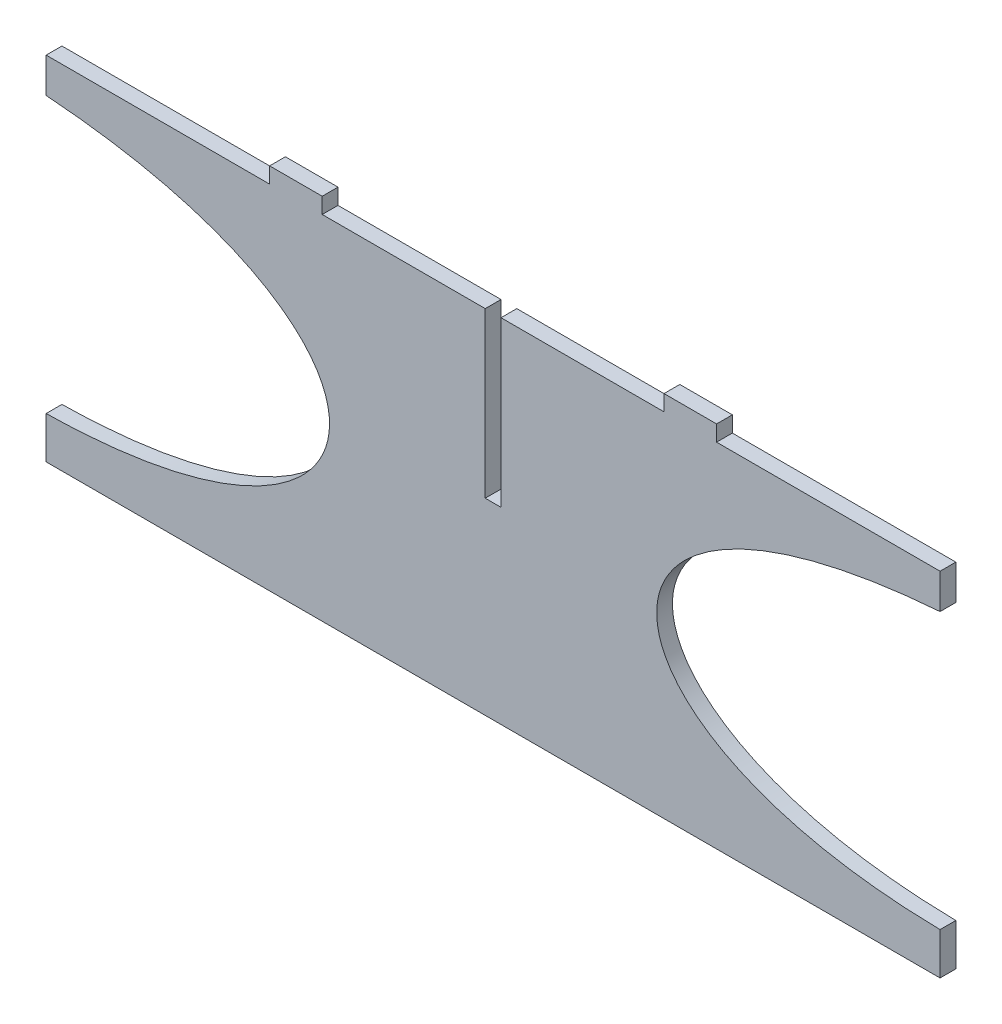
ISO-10303-21;
HEADER;
FILE_DESCRIPTION(('STEP AP214'),'2;1');
FILE_NAME('part.step','',(''),(''),'','','');
FILE_SCHEMA(('AUTOMOTIVE_DESIGN { 1 0 10303 214 1 1 1 1 }'));
ENDSEC;
DATA;
#1=APPLICATION_CONTEXT('core data for automotive mechanical design processes');
#2=APPLICATION_PROTOCOL_DEFINITION('international standard','automotive_design',2000,#1);
#3=PRODUCT_CONTEXT('',#1,'mechanical');
#4=PRODUCT('Part','Part','',(#3));
#5=PRODUCT_RELATED_PRODUCT_CATEGORY('part','',(#4));
#6=PRODUCT_DEFINITION_FORMATION('','',#4);
#7=PRODUCT_DEFINITION_CONTEXT('part definition',#1,'design');
#8=PRODUCT_DEFINITION('design','',#6,#7);
#9=PRODUCT_DEFINITION_SHAPE('','',#8);
#10=(LENGTH_UNIT() NAMED_UNIT(*) SI_UNIT(.MILLI.,.METRE.));
#11=(NAMED_UNIT(*) PLANE_ANGLE_UNIT() SI_UNIT($,.RADIAN.));
#12=(NAMED_UNIT(*) SI_UNIT($,.STERADIAN.) SOLID_ANGLE_UNIT());
#13=UNCERTAINTY_MEASURE_WITH_UNIT(LENGTH_MEASURE(1.E-05),#10,'distance_accuracy_value','');
#14=(GEOMETRIC_REPRESENTATION_CONTEXT(3) GLOBAL_UNCERTAINTY_ASSIGNED_CONTEXT((#13)) GLOBAL_UNIT_ASSIGNED_CONTEXT((#10,
#11,#12)) REPRESENTATION_CONTEXT('',''));
#15=CARTESIAN_POINT('',(0.,0.,0.));
#16=DIRECTION('',(0.,0.,1.));
#17=DIRECTION('',(1.,0.,0.));
#18=AXIS2_PLACEMENT_3D('',#15,#16,#17);
#19=CARTESIAN_POINT('',(-58.8502,-45.1121,2.));
#20=CARTESIAN_POINT('',(-9.0376,-48.8189,2.));
#21=CARTESIAN_POINT('',(-12.8956,-79.3194,2.));
#22=CARTESIAN_POINT('',(-58.8502,-80.0274,2.));
#23=B_SPLINE_CURVE_WITH_KNOTS('',3,(#19,#20,#21,#22),.UNSPECIFIED.,.F.,.F.,(4,4),
(0.0476190476190476,0.0952380952380952),.UNSPECIFIED.);
#24=DIRECTION('',(0.,0.,-1.));
#25=VECTOR('',#24,1.);
#26=SURFACE_OF_LINEAR_EXTRUSION('',#23,#25);
#27=CARTESIAN_POINT('',(-58.8502,-45.1121,0.));
#28=CARTESIAN_POINT('',(-9.0376,-48.8189,0.));
#29=CARTESIAN_POINT('',(-12.8956,-79.3194,0.));
#30=CARTESIAN_POINT('',(-58.8502,-80.0274,0.));
#31=B_SPLINE_CURVE_WITH_KNOTS('',3,(#27,#28,#29,#30),.UNSPECIFIED.,.F.,.F.,(4,4),
(0.0476190476190476,0.0952380952380952),.UNSPECIFIED.);
#32=CARTESIAN_POINT('',(-58.8502,-45.1121,0.));
#33=VERTEX_POINT('',#32);
#34=CARTESIAN_POINT('',(-58.8502,-80.0274,0.));
#35=VERTEX_POINT('',#34);
#36=EDGE_CURVE('E203',#33,#35,#31,.T.);
#37=ORIENTED_EDGE('',*,*,#36,.T.);
#38=DIRECTION('',(0.,0.,-1.));
#39=VECTOR('',#38,1.);
#40=CARTESIAN_POINT('',(-58.8502,-80.0274,2.));
#41=LINE('',#40,#39);
#42=CARTESIAN_POINT('',(-58.8502,-80.0274,2.));
#43=VERTEX_POINT('',#42);
#44=EDGE_CURVE('E11',#43,#35,#41,.T.);
#45=ORIENTED_EDGE('',*,*,#44,.F.);
#46=CARTESIAN_POINT('',(-58.8502,-45.1121,2.));
#47=VERTEX_POINT('',#46);
#48=EDGE_CURVE('E251',#47,#43,#23,.T.);
#49=ORIENTED_EDGE('',*,*,#48,.F.);
#50=DIRECTION('',(0.,0.,-1.));
#51=VECTOR('',#50,1.);
#52=CARTESIAN_POINT('',(-58.8502,-45.1121,2.));
#53=LINE('',#52,#51);
#54=EDGE_CURVE('E199',#47,#33,#53,.T.);
#55=ORIENTED_EDGE('',*,*,#54,.T.);
#56=EDGE_LOOP('',(#37,#45,#49,#55));
#57=FACE_BOUND('',#56,.T.);
#58=ADVANCED_FACE('F34',(#57),#26,.F.);
#59=CARTESIAN_POINT('',(-58.8502,-80.0274,2.));
#60=DIRECTION('',(1.,0.,0.));
#61=DIRECTION('',(0.,0.,-1.));
#62=AXIS2_PLACEMENT_3D('',#59,#60,#61);
#63=PLANE('',#62);
#64=DIRECTION('',(0.,-1.,0.));
#65=VECTOR('',#64,1.);
#66=CARTESIAN_POINT('',(-58.8502,-80.0274,0.));
#67=LINE('',#66,#65);
#68=CARTESIAN_POINT('',(-58.8502,-85.3435,0.));
#69=VERTEX_POINT('',#68);
#70=EDGE_CURVE('E208',#35,#69,#67,.T.);
#71=ORIENTED_EDGE('',*,*,#70,.T.);
#72=DIRECTION('',(0.,0.,-1.));
#73=VECTOR('',#72,1.);
#74=CARTESIAN_POINT('',(-58.8502,-85.3435,2.));
#75=LINE('',#74,#73);
#76=CARTESIAN_POINT('',(-58.8502,-85.3435,2.));
#77=VERTEX_POINT('',#76);
#78=EDGE_CURVE('E43',#77,#69,#75,.T.);
#79=ORIENTED_EDGE('',*,*,#78,.F.);
#80=DIRECTION('',(0.,-1.,0.));
#81=VECTOR('',#80,1.);
#82=CARTESIAN_POINT('',(-58.8502,-80.0274,2.));
#83=LINE('',#82,#81);
#84=EDGE_CURVE('E130',#43,#77,#83,.T.);
#85=ORIENTED_EDGE('',*,*,#84,.F.);
#86=ORIENTED_EDGE('',*,*,#44,.T.);
#87=EDGE_LOOP('',(#71,#79,#85,#86));
#88=FACE_BOUND('',#87,.T.);
#89=ADVANCED_FACE('F342',(#88),#63,.F.);
#90=CARTESIAN_POINT('',(-58.8502,-85.3435,2.));
#91=DIRECTION('',(0.,1.,0.));
#92=DIRECTION('',(0.,0.,1.));
#93=AXIS2_PLACEMENT_3D('',#90,#91,#92);
#94=PLANE('',#93);
#95=DIRECTION('',(1.,0.,0.));
#96=VECTOR('',#95,1.);
#97=CARTESIAN_POINT('',(-58.8502,-85.3435,0.));
#98=LINE('',#97,#96);
#99=CARTESIAN_POINT('',(54.4831,-85.3435,0.));
#100=VERTEX_POINT('',#99);
#101=EDGE_CURVE('E213',#69,#100,#98,.T.);
#102=ORIENTED_EDGE('',*,*,#101,.T.);
#103=DIRECTION('',(0.,0.,-1.));
#104=VECTOR('',#103,1.);
#105=CARTESIAN_POINT('',(54.4831,-85.3435,2.));
#106=LINE('',#105,#104);
#107=CARTESIAN_POINT('',(54.4831,-85.3435,2.));
#108=VERTEX_POINT('',#107);
#109=EDGE_CURVE('E294',#108,#100,#106,.T.);
#110=ORIENTED_EDGE('',*,*,#109,.F.);
#111=DIRECTION('',(1.,0.,0.));
#112=VECTOR('',#111,1.);
#113=CARTESIAN_POINT('',(-58.8502,-85.3435,2.));
#114=LINE('',#113,#112);
#115=EDGE_CURVE('E302',#77,#108,#114,.T.);
#116=ORIENTED_EDGE('',*,*,#115,.F.);
#117=ORIENTED_EDGE('',*,*,#78,.T.);
#118=EDGE_LOOP('',(#102,#110,#116,#117));
#119=FACE_BOUND('',#118,.T.);
#120=ADVANCED_FACE('F300',(#119),#94,.F.);
#121=CARTESIAN_POINT('',(54.4831,-85.3435,2.));
#122=DIRECTION('',(-1.,0.,0.));
#123=DIRECTION('',(0.,0.,1.));
#124=AXIS2_PLACEMENT_3D('',#121,#122,#123);
#125=PLANE('',#124);
#126=DIRECTION('',(0.,1.,0.));
#127=VECTOR('',#126,1.);
#128=CARTESIAN_POINT('',(54.4831,-85.3435,0.));
#129=LINE('',#128,#127);
#130=CARTESIAN_POINT('',(54.4831,-80.0274,0.));
#131=VERTEX_POINT('',#130);
#132=EDGE_CURVE('E215',#100,#131,#129,.T.);
#133=ORIENTED_EDGE('',*,*,#132,.T.);
#134=DIRECTION('',(0.,0.,-1.));
#135=VECTOR('',#134,1.);
#136=CARTESIAN_POINT('',(54.4831,-80.0274,2.));
#137=LINE('',#136,#135);
#138=CARTESIAN_POINT('',(54.4831,-80.0274,2.));
#139=VERTEX_POINT('',#138);
#140=EDGE_CURVE('E291',#139,#131,#137,.T.);
#141=ORIENTED_EDGE('',*,*,#140,.F.);
#142=DIRECTION('',(0.,1.,0.));
#143=VECTOR('',#142,1.);
#144=CARTESIAN_POINT('',(54.4831,-85.3435,2.));
#145=LINE('',#144,#143);
#146=EDGE_CURVE('E320',#108,#139,#145,.T.);
#147=ORIENTED_EDGE('',*,*,#146,.F.);
#148=ORIENTED_EDGE('',*,*,#109,.T.);
#149=EDGE_LOOP('',(#133,#141,#147,#148));
#150=FACE_BOUND('',#149,.T.);
#151=ADVANCED_FACE('F311',(#150),#125,.F.);
#152=CARTESIAN_POINT('',(54.4831,-80.0274,2.));
#153=CARTESIAN_POINT('',(8.5266,-79.3193,2.));
#154=CARTESIAN_POINT('',(4.6696,-48.8189,2.));
#155=CARTESIAN_POINT('',(54.4831,-45.1121,2.));
#156=B_SPLINE_CURVE_WITH_KNOTS('',3,(#152,#153,#154,#155),.UNSPECIFIED.,.F.,.F.,(4,4),
(0.238095238095238,0.285714285714286),.UNSPECIFIED.);
#157=DIRECTION('',(0.,0.,-1.));
#158=VECTOR('',#157,1.);
#159=SURFACE_OF_LINEAR_EXTRUSION('',#156,#158);
#160=CARTESIAN_POINT('',(54.4831,-80.0274,0.));
#161=CARTESIAN_POINT('',(8.5266,-79.3193,0.));
#162=CARTESIAN_POINT('',(4.6696,-48.8189,0.));
#163=CARTESIAN_POINT('',(54.4831,-45.1121,0.));
#164=B_SPLINE_CURVE_WITH_KNOTS('',3,(#160,#161,#162,#163),.UNSPECIFIED.,.F.,.F.,(4,4),
(0.238095238095238,0.285714285714286),.UNSPECIFIED.);
#165=CARTESIAN_POINT('',(54.4831,-45.1121,0.));
#166=VERTEX_POINT('',#165);
#167=EDGE_CURVE('E217',#131,#166,#164,.T.);
#168=ORIENTED_EDGE('',*,*,#167,.T.);
#169=DIRECTION('',(0.,0.,-1.));
#170=VECTOR('',#169,1.);
#171=CARTESIAN_POINT('',(54.4831,-45.1121,2.));
#172=LINE('',#171,#170);
#173=CARTESIAN_POINT('',(54.4831,-45.1121,2.));
#174=VERTEX_POINT('',#173);
#175=EDGE_CURVE('E288',#174,#166,#172,.T.);
#176=ORIENTED_EDGE('',*,*,#175,.F.);
#177=EDGE_CURVE('E317',#139,#174,#156,.T.);
#178=ORIENTED_EDGE('',*,*,#177,.F.);
#179=ORIENTED_EDGE('',*,*,#140,.T.);
#180=EDGE_LOOP('',(#168,#176,#178,#179));
#181=FACE_BOUND('',#180,.T.);
#182=ADVANCED_FACE('F315',(#181),#159,.F.);
#183=CARTESIAN_POINT('',(54.4831,-45.1121,2.));
#184=DIRECTION('',(-1.,0.,0.));
#185=DIRECTION('',(0.,0.,1.));
#186=AXIS2_PLACEMENT_3D('',#183,#184,#185);
#187=PLANE('',#186);
#188=DIRECTION('',(0.,1.,0.));
#189=VECTOR('',#188,1.);
#190=CARTESIAN_POINT('',(54.4831,-45.1121,0.));
#191=LINE('',#190,#189);
#192=CARTESIAN_POINT('',(54.4831,-40.6768,0.));
#193=VERTEX_POINT('',#192);
#194=EDGE_CURVE('E221',#166,#193,#191,.T.);
#195=ORIENTED_EDGE('',*,*,#194,.T.);
#196=DIRECTION('',(0.,0.,-1.));
#197=VECTOR('',#196,1.);
#198=CARTESIAN_POINT('',(54.4831,-40.6768,2.));
#199=LINE('',#198,#197);
#200=CARTESIAN_POINT('',(54.4831,-40.6768,2.));
#201=VERTEX_POINT('',#200);
#202=EDGE_CURVE('E285',#201,#193,#199,.T.);
#203=ORIENTED_EDGE('',*,*,#202,.F.);
#204=DIRECTION('',(0.,1.,0.));
#205=VECTOR('',#204,1.);
#206=CARTESIAN_POINT('',(54.4831,-45.1121,2.));
#207=LINE('',#206,#205);
#208=EDGE_CURVE('E319',#174,#201,#207,.T.);
#209=ORIENTED_EDGE('',*,*,#208,.F.);
#210=ORIENTED_EDGE('',*,*,#175,.T.);
#211=EDGE_LOOP('',(#195,#203,#209,#210));
#212=FACE_BOUND('',#211,.T.);
#213=ADVANCED_FACE('F337',(#212),#187,.F.);
#214=CARTESIAN_POINT('',(54.4831,-40.6768,2.));
#215=DIRECTION('',(0.,-1.,0.));
#216=DIRECTION('',(0.,0.,-1.));
#217=AXIS2_PLACEMENT_3D('',#214,#215,#216);
#218=PLANE('',#217);
#219=DIRECTION('',(-1.,0.,0.));
#220=VECTOR('',#219,1.);
#221=CARTESIAN_POINT('',(54.4831,-40.6768,0.));
#222=LINE('',#221,#220);
#223=CARTESIAN_POINT('',(26.1498,-40.6768,0.));
#224=VERTEX_POINT('',#223);
#225=EDGE_CURVE('E226',#193,#224,#222,.T.);
#226=ORIENTED_EDGE('',*,*,#225,.T.);
#227=DIRECTION('',(0.,0.,-1.));
#228=VECTOR('',#227,1.);
#229=CARTESIAN_POINT('',(26.1498,-40.6768,2.));
#230=LINE('',#229,#228);
#231=CARTESIAN_POINT('',(26.1498,-40.6768,2.));
#232=VERTEX_POINT('',#231);
#233=EDGE_CURVE('E282',#232,#224,#230,.T.);
#234=ORIENTED_EDGE('',*,*,#233,.F.);
#235=DIRECTION('',(-1.,0.,0.));
#236=VECTOR('',#235,1.);
#237=CARTESIAN_POINT('',(54.4831,-40.6768,2.));
#238=LINE('',#237,#236);
#239=EDGE_CURVE('E322',#201,#232,#238,.T.);
#240=ORIENTED_EDGE('',*,*,#239,.F.);
#241=ORIENTED_EDGE('',*,*,#202,.T.);
#242=EDGE_LOOP('',(#226,#234,#240,#241));
#243=FACE_BOUND('',#242,.T.);
#244=ADVANCED_FACE('F411',(#243),#218,.F.);
#245=CARTESIAN_POINT('',(26.1498,-40.6768,2.));
#246=DIRECTION('',(-1.,0.,0.));
#247=DIRECTION('',(0.,0.,1.));
#248=AXIS2_PLACEMENT_3D('',#245,#246,#247);
#249=PLANE('',#248);
#250=DIRECTION('',(0.,1.,0.));
#251=VECTOR('',#250,1.);
#252=CARTESIAN_POINT('',(26.1498,-40.6768,0.));
#253=LINE('',#252,#251);
#254=CARTESIAN_POINT('',(26.1498,-38.6717,0.));
#255=VERTEX_POINT('',#254);
#256=EDGE_CURVE('E228',#224,#255,#253,.T.);
#257=ORIENTED_EDGE('',*,*,#256,.T.);
#258=DIRECTION('',(0.,0.,-1.));
#259=VECTOR('',#258,1.);
#260=CARTESIAN_POINT('',(26.1498,-38.6717,2.));
#261=LINE('',#260,#259);
#262=CARTESIAN_POINT('',(26.1498,-38.6717,2.));
#263=VERTEX_POINT('',#262);
#264=EDGE_CURVE('E279',#263,#255,#261,.T.);
#265=ORIENTED_EDGE('',*,*,#264,.F.);
#266=DIRECTION('',(0.,1.,0.));
#267=VECTOR('',#266,1.);
#268=CARTESIAN_POINT('',(26.1498,-40.6768,2.));
#269=LINE('',#268,#267);
#270=EDGE_CURVE('E408',#232,#263,#269,.T.);
#271=ORIENTED_EDGE('',*,*,#270,.F.);
#272=ORIENTED_EDGE('',*,*,#233,.T.);
#273=EDGE_LOOP('',(#257,#265,#271,#272));
#274=FACE_BOUND('',#273,.T.);
#275=ADVANCED_FACE('F405',(#274),#249,.F.);
#276=CARTESIAN_POINT('',(26.1498,-38.6717,2.));
#277=DIRECTION('',(0.,-1.,0.));
#278=DIRECTION('',(0.,0.,-1.));
#279=AXIS2_PLACEMENT_3D('',#276,#277,#278);
#280=PLANE('',#279);
#281=DIRECTION('',(-1.,0.,0.));
#282=VECTOR('',#281,1.);
#283=CARTESIAN_POINT('',(26.1498,-38.6717,0.));
#284=LINE('',#283,#282);
#285=CARTESIAN_POINT('',(19.4831,-38.6717,0.));
#286=VERTEX_POINT('',#285);
#287=EDGE_CURVE('E230',#255,#286,#284,.T.);
#288=ORIENTED_EDGE('',*,*,#287,.T.);
#289=DIRECTION('',(0.,0.,-1.));
#290=VECTOR('',#289,1.);
#291=CARTESIAN_POINT('',(19.4831,-38.6717,2.));
#292=LINE('',#291,#290);
#293=CARTESIAN_POINT('',(19.4831,-38.6717,2.));
#294=VERTEX_POINT('',#293);
#295=EDGE_CURVE('E276',#294,#286,#292,.T.);
#296=ORIENTED_EDGE('',*,*,#295,.F.);
#297=DIRECTION('',(-1.,0.,0.));
#298=VECTOR('',#297,1.);
#299=CARTESIAN_POINT('',(26.1498,-38.6717,2.));
#300=LINE('',#299,#298);
#301=EDGE_CURVE('E400',#263,#294,#300,.T.);
#302=ORIENTED_EDGE('',*,*,#301,.F.);
#303=ORIENTED_EDGE('',*,*,#264,.T.);
#304=EDGE_LOOP('',(#288,#296,#302,#303));
#305=FACE_BOUND('',#304,.T.);
#306=ADVANCED_FACE('F399',(#305),#280,.F.);
#307=CARTESIAN_POINT('',(19.4831,-38.6717,2.));
#308=DIRECTION('',(1.,0.,0.));
#309=DIRECTION('',(0.,0.,-1.));
#310=AXIS2_PLACEMENT_3D('',#307,#308,#309);
#311=PLANE('',#310);
#312=DIRECTION('',(0.,-1.,0.));
#313=VECTOR('',#312,1.);
#314=CARTESIAN_POINT('',(19.4831,-38.6717,0.));
#315=LINE('',#314,#313);
#316=CARTESIAN_POINT('',(19.4831,-40.6768,0.));
#317=VERTEX_POINT('',#316);
#318=EDGE_CURVE('E232',#286,#317,#315,.T.);
#319=ORIENTED_EDGE('',*,*,#318,.T.);
#320=DIRECTION('',(0.,0.,-1.));
#321=VECTOR('',#320,1.);
#322=CARTESIAN_POINT('',(19.4831,-40.6768,2.));
#323=LINE('',#322,#321);
#324=CARTESIAN_POINT('',(19.4831,-40.6768,2.));
#325=VERTEX_POINT('',#324);
#326=EDGE_CURVE('E273',#325,#317,#323,.T.);
#327=ORIENTED_EDGE('',*,*,#326,.F.);
#328=DIRECTION('',(0.,-1.,0.));
#329=VECTOR('',#328,1.);
#330=CARTESIAN_POINT('',(19.4831,-38.6717,2.));
#331=LINE('',#330,#329);
#332=EDGE_CURVE('E395',#294,#325,#331,.T.);
#333=ORIENTED_EDGE('',*,*,#332,.F.);
#334=ORIENTED_EDGE('',*,*,#295,.T.);
#335=EDGE_LOOP('',(#319,#327,#333,#334));
#336=FACE_BOUND('',#335,.T.);
#337=ADVANCED_FACE('F394',(#336),#311,.F.);
#338=CARTESIAN_POINT('',(19.4831,-40.6768,2.));
#339=DIRECTION('',(0.,-1.,0.));
#340=DIRECTION('',(0.,0.,-1.));
#341=AXIS2_PLACEMENT_3D('',#338,#339,#340);
#342=PLANE('',#341);
#343=DIRECTION('',(-1.,0.,0.));
#344=VECTOR('',#343,1.);
#345=CARTESIAN_POINT('',(19.4831,-40.6768,0.));
#346=LINE('',#345,#344);
#347=CARTESIAN_POINT('',(-1.1835,-40.6768,0.));
#348=VERTEX_POINT('',#347);
#349=EDGE_CURVE('E234',#317,#348,#346,.T.);
#350=ORIENTED_EDGE('',*,*,#349,.T.);
#351=DIRECTION('',(0.,0.,-1.));
#352=VECTOR('',#351,1.);
#353=CARTESIAN_POINT('',(-1.1835,-40.6768,2.));
#354=LINE('',#353,#352);
#355=CARTESIAN_POINT('',(-1.1835,-40.6768,2.));
#356=VERTEX_POINT('',#355);
#357=EDGE_CURVE('E270',#356,#348,#354,.T.);
#358=ORIENTED_EDGE('',*,*,#357,.F.);
#359=DIRECTION('',(-1.,0.,0.));
#360=VECTOR('',#359,1.);
#361=CARTESIAN_POINT('',(19.4831,-40.6768,2.));
#362=LINE('',#361,#360);
#363=EDGE_CURVE('E391',#325,#356,#362,.T.);
#364=ORIENTED_EDGE('',*,*,#363,.F.);
#365=ORIENTED_EDGE('',*,*,#326,.T.);
#366=EDGE_LOOP('',(#350,#358,#364,#365));
#367=FACE_BOUND('',#366,.T.);
#368=ADVANCED_FACE('F388',(#367),#342,.F.);
#369=CARTESIAN_POINT('',(-1.1835,-40.6768,2.));
#370=DIRECTION('',(1.,0.,0.));
#371=DIRECTION('',(0.,0.,-1.));
#372=AXIS2_PLACEMENT_3D('',#369,#370,#371);
#373=PLANE('',#372);
#374=DIRECTION('',(0.,-1.,0.));
#375=VECTOR('',#374,1.);
#376=CARTESIAN_POINT('',(-1.1835,-40.6768,0.));
#377=LINE('',#376,#375);
#378=CARTESIAN_POINT('',(-1.1835,-61.4949,0.));
#379=VERTEX_POINT('',#378);
#380=EDGE_CURVE('E236',#348,#379,#377,.T.);
#381=ORIENTED_EDGE('',*,*,#380,.T.);
#382=DIRECTION('',(0.,0.,-1.));
#383=VECTOR('',#382,1.);
#384=CARTESIAN_POINT('',(-1.1835,-61.4949,2.));
#385=LINE('',#384,#383);
#386=CARTESIAN_POINT('',(-1.1835,-61.4949,2.));
#387=VERTEX_POINT('',#386);
#388=EDGE_CURVE('E267',#387,#379,#385,.T.);
#389=ORIENTED_EDGE('',*,*,#388,.F.);
#390=DIRECTION('',(0.,-1.,0.));
#391=VECTOR('',#390,1.);
#392=CARTESIAN_POINT('',(-1.1835,-40.6768,2.));
#393=LINE('',#392,#391);
#394=EDGE_CURVE('E382',#356,#387,#393,.T.);
#395=ORIENTED_EDGE('',*,*,#394,.F.);
#396=ORIENTED_EDGE('',*,*,#357,.T.);
#397=EDGE_LOOP('',(#381,#389,#395,#396));
#398=FACE_BOUND('',#397,.T.);
#399=ADVANCED_FACE('F381',(#398),#373,.F.);
#400=CARTESIAN_POINT('',(-1.1835,-61.4949,2.));
#401=DIRECTION('',(0.,-1.,0.));
#402=DIRECTION('',(0.,0.,-1.));
#403=AXIS2_PLACEMENT_3D('',#400,#401,#402);
#404=PLANE('',#403);
#405=DIRECTION('',(-1.,0.,0.));
#406=VECTOR('',#405,1.);
#407=CARTESIAN_POINT('',(-1.1835,-61.4949,0.));
#408=LINE('',#407,#406);
#409=CARTESIAN_POINT('',(-3.1835,-61.4949,0.));
#410=VERTEX_POINT('',#409);
#411=EDGE_CURVE('E238',#379,#410,#408,.T.);
#412=ORIENTED_EDGE('',*,*,#411,.T.);
#413=DIRECTION('',(0.,0.,-1.));
#414=VECTOR('',#413,1.);
#415=CARTESIAN_POINT('',(-3.1835,-61.4949,2.));
#416=LINE('',#415,#414);
#417=CARTESIAN_POINT('',(-3.1835,-61.4949,2.));
#418=VERTEX_POINT('',#417);
#419=EDGE_CURVE('E264',#418,#410,#416,.T.);
#420=ORIENTED_EDGE('',*,*,#419,.F.);
#421=DIRECTION('',(-1.,0.,0.));
#422=VECTOR('',#421,1.);
#423=CARTESIAN_POINT('',(-1.1835,-61.4949,2.));
#424=LINE('',#423,#422);
#425=EDGE_CURVE('E377',#387,#418,#424,.T.);
#426=ORIENTED_EDGE('',*,*,#425,.F.);
#427=ORIENTED_EDGE('',*,*,#388,.T.);
#428=EDGE_LOOP('',(#412,#420,#426,#427));
#429=FACE_BOUND('',#428,.T.);
#430=ADVANCED_FACE('F376',(#429),#404,.F.);
#431=CARTESIAN_POINT('',(-3.1835,-61.4949,2.));
#432=DIRECTION('',(-1.,0.,0.));
#433=DIRECTION('',(0.,0.,1.));
#434=AXIS2_PLACEMENT_3D('',#431,#432,#433);
#435=PLANE('',#434);
#436=DIRECTION('',(0.,1.,0.));
#437=VECTOR('',#436,1.);
#438=CARTESIAN_POINT('',(-3.1835,-61.4949,0.));
#439=LINE('',#438,#437);
#440=CARTESIAN_POINT('',(-3.1835,-40.6768,0.));
#441=VERTEX_POINT('',#440);
#442=EDGE_CURVE('E240',#410,#441,#439,.T.);
#443=ORIENTED_EDGE('',*,*,#442,.T.);
#444=DIRECTION('',(0.,0.,-1.));
#445=VECTOR('',#444,1.);
#446=CARTESIAN_POINT('',(-3.1835,-40.6768,2.));
#447=LINE('',#446,#445);
#448=CARTESIAN_POINT('',(-3.1835,-40.6768,2.));
#449=VERTEX_POINT('',#448);
#450=EDGE_CURVE('E261',#449,#441,#447,.T.);
#451=ORIENTED_EDGE('',*,*,#450,.F.);
#452=DIRECTION('',(0.,1.,0.));
#453=VECTOR('',#452,1.);
#454=CARTESIAN_POINT('',(-3.1835,-61.4949,2.));
#455=LINE('',#454,#453);
#456=EDGE_CURVE('E373',#418,#449,#455,.T.);
#457=ORIENTED_EDGE('',*,*,#456,.F.);
#458=ORIENTED_EDGE('',*,*,#419,.T.);
#459=EDGE_LOOP('',(#443,#451,#457,#458));
#460=FACE_BOUND('',#459,.T.);
#461=ADVANCED_FACE('F370',(#460),#435,.F.);
#462=CARTESIAN_POINT('',(-3.1835,-40.6768,2.));
#463=DIRECTION('',(0.,-1.,0.));
#464=DIRECTION('',(0.,0.,-1.));
#465=AXIS2_PLACEMENT_3D('',#462,#463,#464);
#466=PLANE('',#465);
#467=DIRECTION('',(-1.,0.,0.));
#468=VECTOR('',#467,1.);
#469=CARTESIAN_POINT('',(-3.1835,-40.6768,0.));
#470=LINE('',#469,#468);
#471=CARTESIAN_POINT('',(-23.8502,-40.6768,0.));
#472=VERTEX_POINT('',#471);
#473=EDGE_CURVE('E242',#441,#472,#470,.T.);
#474=ORIENTED_EDGE('',*,*,#473,.T.);
#475=DIRECTION('',(0.,0.,-1.));
#476=VECTOR('',#475,1.);
#477=CARTESIAN_POINT('',(-23.8502,-40.6768,2.));
#478=LINE('',#477,#476);
#479=CARTESIAN_POINT('',(-23.8502,-40.6768,2.));
#480=VERTEX_POINT('',#479);
#481=EDGE_CURVE('E258',#480,#472,#478,.T.);
#482=ORIENTED_EDGE('',*,*,#481,.F.);
#483=DIRECTION('',(-1.,0.,0.));
#484=VECTOR('',#483,1.);
#485=CARTESIAN_POINT('',(-3.1835,-40.6768,2.));
#486=LINE('',#485,#484);
#487=EDGE_CURVE('E364',#449,#480,#486,.T.);
#488=ORIENTED_EDGE('',*,*,#487,.F.);
#489=ORIENTED_EDGE('',*,*,#450,.T.);
#490=EDGE_LOOP('',(#474,#482,#488,#489));
#491=FACE_BOUND('',#490,.T.);
#492=ADVANCED_FACE('F363',(#491),#466,.F.);
#493=CARTESIAN_POINT('',(-23.8502,-40.6768,2.));
#494=DIRECTION('',(-1.,0.,0.));
#495=DIRECTION('',(0.,0.,1.));
#496=AXIS2_PLACEMENT_3D('',#493,#494,#495);
#497=PLANE('',#496);
#498=DIRECTION('',(0.,1.,0.));
#499=VECTOR('',#498,1.);
#500=CARTESIAN_POINT('',(-23.8502,-40.6768,0.));
#501=LINE('',#500,#499);
#502=CARTESIAN_POINT('',(-23.8502,-38.6717,0.));
#503=VERTEX_POINT('',#502);
#504=EDGE_CURVE('E244',#472,#503,#501,.T.);
#505=ORIENTED_EDGE('',*,*,#504,.T.);
#506=DIRECTION('',(0.,0.,-1.));
#507=VECTOR('',#506,1.);
#508=CARTESIAN_POINT('',(-23.8502,-38.6717,2.));
#509=LINE('',#508,#507);
#510=CARTESIAN_POINT('',(-23.8502,-38.6717,2.));
#511=VERTEX_POINT('',#510);
#512=EDGE_CURVE('E255',#511,#503,#509,.T.);
#513=ORIENTED_EDGE('',*,*,#512,.F.);
#514=DIRECTION('',(0.,1.,0.));
#515=VECTOR('',#514,1.);
#516=CARTESIAN_POINT('',(-23.8502,-40.6768,2.));
#517=LINE('',#516,#515);
#518=EDGE_CURVE('E359',#480,#511,#517,.T.);
#519=ORIENTED_EDGE('',*,*,#518,.F.);
#520=ORIENTED_EDGE('',*,*,#481,.T.);
#521=EDGE_LOOP('',(#505,#513,#519,#520));
#522=FACE_BOUND('',#521,.T.);
#523=ADVANCED_FACE('F358',(#522),#497,.F.);
#524=CARTESIAN_POINT('',(-23.8502,-38.6717,2.));
#525=DIRECTION('',(0.,-1.,0.));
#526=DIRECTION('',(0.,0.,-1.));
#527=AXIS2_PLACEMENT_3D('',#524,#525,#526);
#528=PLANE('',#527);
#529=DIRECTION('',(-1.,0.,0.));
#530=VECTOR('',#529,1.);
#531=CARTESIAN_POINT('',(-23.8502,-38.6717,0.));
#532=LINE('',#531,#530);
#533=CARTESIAN_POINT('',(-30.5169,-38.6717,0.));
#534=VERTEX_POINT('',#533);
#535=EDGE_CURVE('E246',#503,#534,#532,.T.);
#536=ORIENTED_EDGE('',*,*,#535,.T.);
#537=DIRECTION('',(0.,0.,-1.));
#538=VECTOR('',#537,1.);
#539=CARTESIAN_POINT('',(-30.5169,-38.6717,2.));
#540=LINE('',#539,#538);
#541=CARTESIAN_POINT('',(-30.5169,-38.6717,2.));
#542=VERTEX_POINT('',#541);
#543=EDGE_CURVE('E194',#542,#534,#540,.T.);
#544=ORIENTED_EDGE('',*,*,#543,.F.);
#545=DIRECTION('',(-1.,0.,0.));
#546=VECTOR('',#545,1.);
#547=CARTESIAN_POINT('',(-23.8502,-38.6717,2.));
#548=LINE('',#547,#546);
#549=EDGE_CURVE('E185',#511,#542,#548,.T.);
#550=ORIENTED_EDGE('',*,*,#549,.F.);
#551=ORIENTED_EDGE('',*,*,#512,.T.);
#552=EDGE_LOOP('',(#536,#544,#550,#551));
#553=FACE_BOUND('',#552,.T.);
#554=ADVANCED_FACE('F354',(#553),#528,.F.);
#555=CARTESIAN_POINT('',(-30.5169,-38.6717,2.));
#556=DIRECTION('',(1.,0.,0.));
#557=DIRECTION('',(0.,0.,-1.));
#558=AXIS2_PLACEMENT_3D('',#555,#556,#557);
#559=PLANE('',#558);
#560=DIRECTION('',(0.,-1.,0.));
#561=VECTOR('',#560,1.);
#562=CARTESIAN_POINT('',(-30.5169,-38.6717,0.));
#563=LINE('',#562,#561);
#564=CARTESIAN_POINT('',(-30.5169,-40.6768,0.));
#565=VERTEX_POINT('',#564);
#566=EDGE_CURVE('E193',#534,#565,#563,.T.);
#567=ORIENTED_EDGE('',*,*,#566,.T.);
#568=DIRECTION('',(0.,0.,-1.));
#569=VECTOR('',#568,1.);
#570=CARTESIAN_POINT('',(-30.5169,-40.6768,2.));
#571=LINE('',#570,#569);
#572=CARTESIAN_POINT('',(-30.5169,-40.6768,2.));
#573=VERTEX_POINT('',#572);
#574=EDGE_CURVE('E190',#573,#565,#571,.T.);
#575=ORIENTED_EDGE('',*,*,#574,.F.);
#576=DIRECTION('',(0.,-1.,0.));
#577=VECTOR('',#576,1.);
#578=CARTESIAN_POINT('',(-30.5169,-38.6717,2.));
#579=LINE('',#578,#577);
#580=EDGE_CURVE('E179',#542,#573,#579,.T.);
#581=ORIENTED_EDGE('',*,*,#580,.F.);
#582=ORIENTED_EDGE('',*,*,#543,.T.);
#583=EDGE_LOOP('',(#567,#575,#581,#582));
#584=FACE_BOUND('',#583,.T.);
#585=ADVANCED_FACE('F191',(#584),#559,.F.);
#586=CARTESIAN_POINT('',(-30.5169,-40.6768,2.));
#587=DIRECTION('',(0.,-1.,0.));
#588=DIRECTION('',(0.,0.,-1.));
#589=AXIS2_PLACEMENT_3D('',#586,#587,#588);
#590=PLANE('',#589);
#591=DIRECTION('',(-1.,0.,0.));
#592=VECTOR('',#591,1.);
#593=CARTESIAN_POINT('',(-30.5169,-40.6768,0.));
#594=LINE('',#593,#592);
#595=CARTESIAN_POINT('',(-58.8502,-40.6768,0.));
#596=VERTEX_POINT('',#595);
#597=EDGE_CURVE('E116',#565,#596,#594,.T.);
#598=ORIENTED_EDGE('',*,*,#597,.T.);
#599=DIRECTION('',(0.,0.,-1.));
#600=VECTOR('',#599,1.);
#601=CARTESIAN_POINT('',(-58.8502,-40.6768,2.));
#602=LINE('',#601,#600);
#603=CARTESIAN_POINT('',(-58.8502,-40.6768,2.));
#604=VERTEX_POINT('',#603);
#605=EDGE_CURVE('E195',#604,#596,#602,.T.);
#606=ORIENTED_EDGE('',*,*,#605,.F.);
#607=DIRECTION('',(-1.,0.,0.));
#608=VECTOR('',#607,1.);
#609=CARTESIAN_POINT('',(-30.5169,-40.6768,2.));
#610=LINE('',#609,#608);
#611=EDGE_CURVE('E183',#573,#604,#610,.T.);
#612=ORIENTED_EDGE('',*,*,#611,.F.);
#613=ORIENTED_EDGE('',*,*,#574,.T.);
#614=EDGE_LOOP('',(#598,#606,#612,#613));
#615=FACE_BOUND('',#614,.T.);
#616=ADVANCED_FACE('F197',(#615),#590,.F.);
#617=CARTESIAN_POINT('',(-58.8502,-40.6768,2.));
#618=DIRECTION('',(1.,0.,0.));
#619=DIRECTION('',(0.,0.,-1.));
#620=AXIS2_PLACEMENT_3D('',#617,#618,#619);
#621=PLANE('',#620);
#622=DIRECTION('',(0.,-1.,0.));
#623=VECTOR('',#622,1.);
#624=CARTESIAN_POINT('',(-58.8502,-40.6768,0.));
#625=LINE('',#624,#623);
#626=EDGE_CURVE('E122',#596,#33,#625,.T.);
#627=ORIENTED_EDGE('',*,*,#626,.T.);
#628=ORIENTED_EDGE('',*,*,#54,.F.);
#629=DIRECTION('',(0.,-1.,0.));
#630=VECTOR('',#629,1.);
#631=CARTESIAN_POINT('',(-58.8502,-40.6768,2.));
#632=LINE('',#631,#630);
#633=EDGE_CURVE('E51',#604,#47,#632,.T.);
#634=ORIENTED_EDGE('',*,*,#633,.F.);
#635=ORIENTED_EDGE('',*,*,#605,.T.);
#636=EDGE_LOOP('',(#627,#628,#634,#635));
#637=FACE_BOUND('',#636,.T.);
#638=ADVANCED_FACE('F454',(#637),#621,.F.);
#639=CARTESIAN_POINT('',(-22.9375,-63.6943,2.));
#640=DIRECTION('',(0.,0.,1.));
#641=DIRECTION('',(1.,0.,0.));
#642=AXIS2_PLACEMENT_3D('',#639,#640,#641);
#643=PLANE('',#642);
#644=ORIENTED_EDGE('',*,*,#48,.T.);
#645=ORIENTED_EDGE('',*,*,#84,.T.);
#646=ORIENTED_EDGE('',*,*,#115,.T.);
#647=ORIENTED_EDGE('',*,*,#146,.T.);
#648=ORIENTED_EDGE('',*,*,#177,.T.);
#649=ORIENTED_EDGE('',*,*,#208,.T.);
#650=ORIENTED_EDGE('',*,*,#239,.T.);
#651=ORIENTED_EDGE('',*,*,#270,.T.);
#652=ORIENTED_EDGE('',*,*,#301,.T.);
#653=ORIENTED_EDGE('',*,*,#332,.T.);
#654=ORIENTED_EDGE('',*,*,#363,.T.);
#655=ORIENTED_EDGE('',*,*,#394,.T.);
#656=ORIENTED_EDGE('',*,*,#425,.T.);
#657=ORIENTED_EDGE('',*,*,#456,.T.);
#658=ORIENTED_EDGE('',*,*,#487,.T.);
#659=ORIENTED_EDGE('',*,*,#518,.T.);
#660=ORIENTED_EDGE('',*,*,#549,.T.);
#661=ORIENTED_EDGE('',*,*,#580,.T.);
#662=ORIENTED_EDGE('',*,*,#611,.T.);
#663=ORIENTED_EDGE('',*,*,#633,.T.);
#664=EDGE_LOOP('',(#644,#645,#646,#647,#648,#649,#650,#651,#652,#653,#654,#655,#656,#657,#658,
#659,#660,#661,#662,#663));
#665=FACE_BOUND('',#664,.T.);
#666=ADVANCED_FACE('F181',(#665),#643,.T.);
#667=CARTESIAN_POINT('',(-22.9375,-63.6943,0.));
#668=DIRECTION('',(0.,0.,1.));
#669=DIRECTION('',(1.,0.,0.));
#670=AXIS2_PLACEMENT_3D('',#667,#668,#669);
#671=PLANE('',#670);
#672=ORIENTED_EDGE('',*,*,#36,.F.);
#673=ORIENTED_EDGE('',*,*,#626,.F.);
#674=ORIENTED_EDGE('',*,*,#597,.F.);
#675=ORIENTED_EDGE('',*,*,#566,.F.);
#676=ORIENTED_EDGE('',*,*,#535,.F.);
#677=ORIENTED_EDGE('',*,*,#504,.F.);
#678=ORIENTED_EDGE('',*,*,#473,.F.);
#679=ORIENTED_EDGE('',*,*,#442,.F.);
#680=ORIENTED_EDGE('',*,*,#411,.F.);
#681=ORIENTED_EDGE('',*,*,#380,.F.);
#682=ORIENTED_EDGE('',*,*,#349,.F.);
#683=ORIENTED_EDGE('',*,*,#318,.F.);
#684=ORIENTED_EDGE('',*,*,#287,.F.);
#685=ORIENTED_EDGE('',*,*,#256,.F.);
#686=ORIENTED_EDGE('',*,*,#225,.F.);
#687=ORIENTED_EDGE('',*,*,#194,.F.);
#688=ORIENTED_EDGE('',*,*,#167,.F.);
#689=ORIENTED_EDGE('',*,*,#132,.F.);
#690=ORIENTED_EDGE('',*,*,#101,.F.);
#691=ORIENTED_EDGE('',*,*,#70,.F.);
#692=EDGE_LOOP('',(#672,#673,#674,#675,#676,#677,#678,#679,#680,#681,#682,#683,#684,#685,#686,
#687,#688,#689,#690,#691));
#693=FACE_BOUND('',#692,.T.);
#694=ADVANCED_FACE('F306',(#693),#671,.F.);
#695=CLOSED_SHELL('',(#58,#89,#120,#151,#182,#213,#244,#275,#306,#337,#368,#399,#430,#461,#492,
#523,#554,#585,#616,#638,#666,#694));
#696=MANIFOLD_SOLID_BREP('B2',#695);
#697=ADVANCED_BREP_SHAPE_REPRESENTATION('',(#18,#696),#14);
#698=SHAPE_DEFINITION_REPRESENTATION(#9,#697);
ENDSEC;
END-ISO-10303-21;
